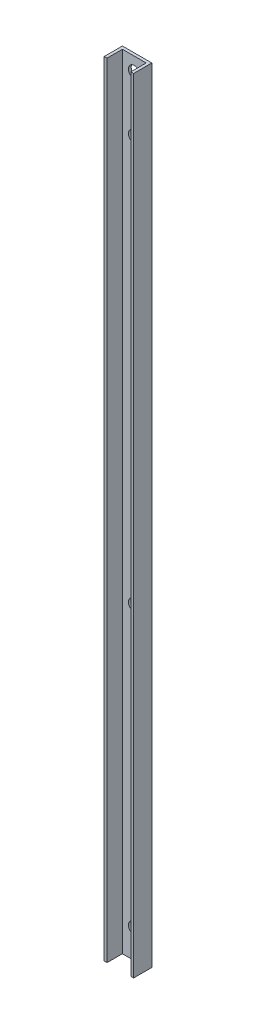
ISO-10303-21;
HEADER;
FILE_DESCRIPTION(('STEP AP214'),'2;1');
FILE_NAME('part.step','',(''),(''),'','','');
FILE_SCHEMA(('AUTOMOTIVE_DESIGN { 1 0 10303 214 1 1 1 1 }'));
ENDSEC;
DATA;
#1=APPLICATION_CONTEXT('core data for automotive mechanical design processes');
#2=APPLICATION_PROTOCOL_DEFINITION('international standard','automotive_design',2000,#1);
#3=PRODUCT_CONTEXT('',#1,'mechanical');
#4=PRODUCT('Part','Part','',(#3));
#5=PRODUCT_RELATED_PRODUCT_CATEGORY('part','',(#4));
#6=PRODUCT_DEFINITION_FORMATION('','',#4);
#7=PRODUCT_DEFINITION_CONTEXT('part definition',#1,'design');
#8=PRODUCT_DEFINITION('design','',#6,#7);
#9=PRODUCT_DEFINITION_SHAPE('','',#8);
#10=(LENGTH_UNIT() NAMED_UNIT(*) SI_UNIT(.MILLI.,.METRE.));
#11=(NAMED_UNIT(*) PLANE_ANGLE_UNIT() SI_UNIT($,.RADIAN.));
#12=(NAMED_UNIT(*) SI_UNIT($,.STERADIAN.) SOLID_ANGLE_UNIT());
#13=UNCERTAINTY_MEASURE_WITH_UNIT(LENGTH_MEASURE(1.E-05),#10,'distance_accuracy_value','');
#14=(GEOMETRIC_REPRESENTATION_CONTEXT(3) GLOBAL_UNCERTAINTY_ASSIGNED_CONTEXT((#13)) GLOBAL_UNIT_ASSIGNED_CONTEXT((#10,
#11,#12)) REPRESENTATION_CONTEXT('',''));
#15=CARTESIAN_POINT('',(0.,0.,0.));
#16=DIRECTION('',(0.,0.,1.));
#17=DIRECTION('',(1.,0.,0.));
#18=AXIS2_PLACEMENT_3D('',#15,#16,#17);
#19=CARTESIAN_POINT('',(6.03004291845494,280.,-4.68669527896996));
#20=DIRECTION('',(1.,0.,0.));
#21=DIRECTION('',(0.,0.,-1.));
#22=AXIS2_PLACEMENT_3D('',#19,#20,#21);
#23=PLANE('',#22);
#24=DIRECTION('',(0.,0.,1.));
#25=VECTOR('',#24,1.);
#26=CARTESIAN_POINT('',(6.03004291845494,0.,-4.68669527896996));
#27=LINE('',#26,#25);
#28=CARTESIAN_POINT('',(6.03004291845494,0.,-3.68669527896996));
#29=VERTEX_POINT('',#28);
#30=CARTESIAN_POINT('',(6.03004291845494,0.,1.81330472103004));
#31=VERTEX_POINT('',#30);
#32=EDGE_CURVE('E131',#29,#31,#27,.T.);
#33=ORIENTED_EDGE('',*,*,#32,.T.);
#34=DIRECTION('',(0.,-1.,0.));
#35=VECTOR('',#34,1.);
#36=CARTESIAN_POINT('',(6.03004291845494,280.,1.81330472103004));
#37=LINE('',#36,#35);
#38=CARTESIAN_POINT('',(6.03004291845494,280.,1.81330472103004));
#39=VERTEX_POINT('',#38);
#40=EDGE_CURVE('E11',#39,#31,#37,.T.);
#41=ORIENTED_EDGE('',*,*,#40,.F.);
#42=DIRECTION('',(0.,0.,1.));
#43=VECTOR('',#42,1.);
#44=CARTESIAN_POINT('',(6.03004291845494,280.,-4.68669527896996));
#45=LINE('',#44,#43);
#46=CARTESIAN_POINT('',(6.03004291845494,280.,-3.68669527896996));
#47=VERTEX_POINT('',#46);
#48=EDGE_CURVE('E89',#47,#39,#45,.T.);
#49=ORIENTED_EDGE('',*,*,#48,.F.);
#50=DIRECTION('',(0.,-1.,0.));
#51=VECTOR('',#50,1.);
#52=CARTESIAN_POINT('',(6.03004291845494,280.,-3.68669527896996));
#53=LINE('',#52,#51);
#54=EDGE_CURVE('E130',#47,#29,#53,.T.);
#55=ORIENTED_EDGE('',*,*,#54,.T.);
#56=EDGE_LOOP('',(#33,#41,#49,#55));
#57=FACE_BOUND('',#56,.T.);
#58=ADVANCED_FACE('F32',(#57),#23,.F.);
#59=CARTESIAN_POINT('',(7.03004291845494,280.,1.81330472103004));
#60=DIRECTION('',(0.,0.,1.));
#61=DIRECTION('',(1.,0.,0.));
#62=AXIS2_PLACEMENT_3D('',#59,#60,#61);
#63=PLANE('',#62);
#64=DIRECTION('',(-1.,0.,0.));
#65=VECTOR('',#64,1.);
#66=CARTESIAN_POINT('',(7.03004291845494,0.,1.81330472103004));
#67=LINE('',#66,#65);
#68=CARTESIAN_POINT('',(7.03004291845494,0.,1.81330472103004));
#69=VERTEX_POINT('',#68);
#70=EDGE_CURVE('E134',#69,#31,#67,.T.);
#71=ORIENTED_EDGE('',*,*,#70,.F.);
#72=DIRECTION('',(0.,-1.,0.));
#73=VECTOR('',#72,1.);
#74=CARTESIAN_POINT('',(7.03004291845494,280.,1.81330472103004));
#75=LINE('',#74,#73);
#76=CARTESIAN_POINT('',(7.03004291845494,280.,1.81330472103004));
#77=VERTEX_POINT('',#76);
#78=EDGE_CURVE('E41',#77,#69,#75,.T.);
#79=ORIENTED_EDGE('',*,*,#78,.F.);
#80=DIRECTION('',(-1.,0.,0.));
#81=VECTOR('',#80,1.);
#82=CARTESIAN_POINT('',(7.03004291845494,280.,1.81330472103004));
#83=LINE('',#82,#81);
#84=EDGE_CURVE('E182',#77,#39,#83,.T.);
#85=ORIENTED_EDGE('',*,*,#84,.T.);
#86=ORIENTED_EDGE('',*,*,#40,.T.);
#87=EDGE_LOOP('',(#71,#79,#85,#86));
#88=FACE_BOUND('',#87,.T.);
#89=ADVANCED_FACE('F213',(#88),#63,.T.);
#90=CARTESIAN_POINT('',(7.03004291845494,280.,-4.68669527896996));
#91=DIRECTION('',(1.,0.,0.));
#92=DIRECTION('',(0.,0.,-1.));
#93=AXIS2_PLACEMENT_3D('',#90,#91,#92);
#94=PLANE('',#93);
#95=DIRECTION('',(0.,0.,1.));
#96=VECTOR('',#95,1.);
#97=CARTESIAN_POINT('',(7.03004291845494,0.,-4.68669527896996));
#98=LINE('',#97,#96);
#99=CARTESIAN_POINT('',(7.03004291845494,0.,-4.68669527896996));
#100=VERTEX_POINT('',#99);
#101=EDGE_CURVE('E138',#100,#69,#98,.T.);
#102=ORIENTED_EDGE('',*,*,#101,.F.);
#103=DIRECTION('',(0.,-1.,0.));
#104=VECTOR('',#103,1.);
#105=CARTESIAN_POINT('',(7.03004291845494,280.,-4.68669527896996));
#106=LINE('',#105,#104);
#107=CARTESIAN_POINT('',(7.03004291845494,280.,-4.68669527896996));
#108=VERTEX_POINT('',#107);
#109=EDGE_CURVE('E155',#108,#100,#106,.T.);
#110=ORIENTED_EDGE('',*,*,#109,.F.);
#111=DIRECTION('',(0.,0.,1.));
#112=VECTOR('',#111,1.);
#113=CARTESIAN_POINT('',(7.03004291845494,280.,-4.68669527896996));
#114=LINE('',#113,#112);
#115=EDGE_CURVE('E185',#108,#77,#114,.T.);
#116=ORIENTED_EDGE('',*,*,#115,.T.);
#117=ORIENTED_EDGE('',*,*,#78,.T.);
#118=EDGE_LOOP('',(#102,#110,#116,#117));
#119=FACE_BOUND('',#118,.T.);
#120=ADVANCED_FACE('F217',(#119),#94,.T.);
#121=CARTESIAN_POINT('',(-3.46995708154506,280.,-4.68669527896996));
#122=DIRECTION('',(0.,0.,-1.));
#123=DIRECTION('',(-1.,0.,0.));
#124=AXIS2_PLACEMENT_3D('',#121,#122,#123);
#125=PLANE('',#124);
#126=CARTESIAN_POINT('',(1.78004291845504,9.99999999999993,-4.68669527896996));
#127=DIRECTION('',(0.,0.,-1.));
#128=DIRECTION('',(-1.,0.,0.));
#129=AXIS2_PLACEMENT_3D('',#126,#127,#128);
#130=CIRCLE('',#129,2.1);
#131=CARTESIAN_POINT('',(-0.319957081544957,9.99999999999993,-4.68669527896996));
#132=VERTEX_POINT('',#131);
#133=EDGE_CURVE('E176',#132,#132,#130,.T.);
#134=ORIENTED_EDGE('',*,*,#133,.F.);
#135=EDGE_LOOP('',(#134));
#136=FACE_BOUND('',#135,.T.);
#137=CARTESIAN_POINT('',(1.78004291845503,110.,-4.68669527896996));
#138=DIRECTION('',(0.,0.,-1.));
#139=DIRECTION('',(-1.,0.,0.));
#140=AXIS2_PLACEMENT_3D('',#137,#138,#139);
#141=CIRCLE('',#140,2.1);
#142=CARTESIAN_POINT('',(-0.319957081544972,110.,-4.68669527896996));
#143=VERTEX_POINT('',#142);
#144=EDGE_CURVE('E166',#143,#143,#141,.T.);
#145=ORIENTED_EDGE('',*,*,#144,.F.);
#146=EDGE_LOOP('',(#145));
#147=FACE_BOUND('',#146,.T.);
#148=CARTESIAN_POINT('',(1.780042918455,255.,-4.68669527896996));
#149=DIRECTION('',(0.,0.,-1.));
#150=DIRECTION('',(-1.,0.,0.));
#151=AXIS2_PLACEMENT_3D('',#148,#149,#150);
#152=CIRCLE('',#151,2.1);
#153=CARTESIAN_POINT('',(-0.319957081545003,255.,-4.68669527896996));
#154=VERTEX_POINT('',#153);
#155=EDGE_CURVE('E163',#154,#154,#152,.T.);
#156=ORIENTED_EDGE('',*,*,#155,.F.);
#157=EDGE_LOOP('',(#156));
#158=FACE_BOUND('',#157,.T.);
#159=CARTESIAN_POINT('',(1.780042918455,275.,-4.68669527896996));
#160=DIRECTION('',(0.,0.,-1.));
#161=DIRECTION('',(-1.,0.,0.));
#162=AXIS2_PLACEMENT_3D('',#159,#160,#161);
#163=CIRCLE('',#162,2.1);
#164=CARTESIAN_POINT('',(-0.319957081545003,275.,-4.68669527896996));
#165=VERTEX_POINT('',#164);
#166=EDGE_CURVE('E160',#165,#165,#163,.T.);
#167=ORIENTED_EDGE('',*,*,#166,.F.);
#168=EDGE_LOOP('',(#167));
#169=FACE_BOUND('',#168,.T.);
#170=DIRECTION('',(1.,0.,0.));
#171=VECTOR('',#170,1.);
#172=CARTESIAN_POINT('',(-3.46995708154506,0.,-4.68669527896996));
#173=LINE('',#172,#171);
#174=CARTESIAN_POINT('',(-3.46995708154506,0.,-4.68669527896996));
#175=VERTEX_POINT('',#174);
#176=EDGE_CURVE('E141',#175,#100,#173,.T.);
#177=ORIENTED_EDGE('',*,*,#176,.F.);
#178=DIRECTION('',(0.,-1.,0.));
#179=VECTOR('',#178,1.);
#180=CARTESIAN_POINT('',(-3.46995708154506,280.,-4.68669527896996));
#181=LINE('',#180,#179);
#182=CARTESIAN_POINT('',(-3.46995708154506,280.,-4.68669527896996));
#183=VERTEX_POINT('',#182);
#184=EDGE_CURVE('E153',#183,#175,#181,.T.);
#185=ORIENTED_EDGE('',*,*,#184,.F.);
#186=DIRECTION('',(1.,0.,0.));
#187=VECTOR('',#186,1.);
#188=CARTESIAN_POINT('',(-3.46995708154506,280.,-4.68669527896996));
#189=LINE('',#188,#187);
#190=EDGE_CURVE('E125',#183,#108,#189,.T.);
#191=ORIENTED_EDGE('',*,*,#190,.T.);
#192=ORIENTED_EDGE('',*,*,#109,.T.);
#193=EDGE_LOOP('',(#177,#185,#191,#192));
#194=FACE_BOUND('',#193,.T.);
#195=ADVANCED_FACE('F190',(#136,#147,#158,#169,#194),#125,.T.);
#196=CARTESIAN_POINT('',(-3.46995708154506,280.,1.81330472103004));
#197=DIRECTION('',(-1.,0.,0.));
#198=DIRECTION('',(0.,0.,1.));
#199=AXIS2_PLACEMENT_3D('',#196,#197,#198);
#200=PLANE('',#199);
#201=DIRECTION('',(0.,0.,-1.));
#202=VECTOR('',#201,1.);
#203=CARTESIAN_POINT('',(-3.46995708154506,0.,1.81330472103004));
#204=LINE('',#203,#202);
#205=CARTESIAN_POINT('',(-3.46995708154506,0.,1.81330472103004));
#206=VERTEX_POINT('',#205);
#207=EDGE_CURVE('E144',#206,#175,#204,.T.);
#208=ORIENTED_EDGE('',*,*,#207,.F.);
#209=DIRECTION('',(0.,-1.,0.));
#210=VECTOR('',#209,1.);
#211=CARTESIAN_POINT('',(-3.46995708154506,280.,1.81330472103004));
#212=LINE('',#211,#210);
#213=CARTESIAN_POINT('',(-3.46995708154506,280.,1.81330472103004));
#214=VERTEX_POINT('',#213);
#215=EDGE_CURVE('E113',#214,#206,#212,.T.);
#216=ORIENTED_EDGE('',*,*,#215,.F.);
#217=DIRECTION('',(0.,0.,-1.));
#218=VECTOR('',#217,1.);
#219=CARTESIAN_POINT('',(-3.46995708154506,280.,1.81330472103004));
#220=LINE('',#219,#218);
#221=EDGE_CURVE('E123',#214,#183,#220,.T.);
#222=ORIENTED_EDGE('',*,*,#221,.T.);
#223=ORIENTED_EDGE('',*,*,#184,.T.);
#224=EDGE_LOOP('',(#208,#216,#222,#223));
#225=FACE_BOUND('',#224,.T.);
#226=ADVANCED_FACE('F195',(#225),#200,.T.);
#227=CARTESIAN_POINT('',(-2.46995708154506,280.,1.81330472103004));
#228=DIRECTION('',(0.,0.,1.));
#229=DIRECTION('',(1.,0.,0.));
#230=AXIS2_PLACEMENT_3D('',#227,#228,#229);
#231=PLANE('',#230);
#232=DIRECTION('',(-1.,0.,0.));
#233=VECTOR('',#232,1.);
#234=CARTESIAN_POINT('',(-2.46995708154506,0.,1.81330472103004));
#235=LINE('',#234,#233);
#236=CARTESIAN_POINT('',(-2.46995708154506,0.,1.81330472103004));
#237=VERTEX_POINT('',#236);
#238=EDGE_CURVE('E112',#237,#206,#235,.T.);
#239=ORIENTED_EDGE('',*,*,#238,.F.);
#240=DIRECTION('',(0.,-1.,0.));
#241=VECTOR('',#240,1.);
#242=CARTESIAN_POINT('',(-2.46995708154506,280.,1.81330472103004));
#243=LINE('',#242,#241);
#244=CARTESIAN_POINT('',(-2.46995708154506,280.,1.81330472103004));
#245=VERTEX_POINT('',#244);
#246=EDGE_CURVE('E106',#245,#237,#243,.T.);
#247=ORIENTED_EDGE('',*,*,#246,.F.);
#248=DIRECTION('',(-1.,0.,0.));
#249=VECTOR('',#248,1.);
#250=CARTESIAN_POINT('',(-2.46995708154506,280.,1.81330472103004));
#251=LINE('',#250,#249);
#252=EDGE_CURVE('E110',#245,#214,#251,.T.);
#253=ORIENTED_EDGE('',*,*,#252,.T.);
#254=ORIENTED_EDGE('',*,*,#215,.T.);
#255=EDGE_LOOP('',(#239,#247,#253,#254));
#256=FACE_BOUND('',#255,.T.);
#257=ADVANCED_FACE('F108',(#256),#231,.T.);
#258=CARTESIAN_POINT('',(-2.46995708154506,280.,1.81330472103004));
#259=DIRECTION('',(-1.,0.,0.));
#260=DIRECTION('',(0.,0.,1.));
#261=AXIS2_PLACEMENT_3D('',#258,#259,#260);
#262=PLANE('',#261);
#263=DIRECTION('',(0.,0.,-1.));
#264=VECTOR('',#263,1.);
#265=CARTESIAN_POINT('',(-2.46995708154506,0.,1.81330472103004));
#266=LINE('',#265,#264);
#267=CARTESIAN_POINT('',(-2.46995708154506,0.,-3.68669527896996));
#268=VERTEX_POINT('',#267);
#269=EDGE_CURVE('E77',#237,#268,#266,.T.);
#270=ORIENTED_EDGE('',*,*,#269,.T.);
#271=DIRECTION('',(0.,-1.,0.));
#272=VECTOR('',#271,1.);
#273=CARTESIAN_POINT('',(-2.46995708154506,280.,-3.68669527896996));
#274=LINE('',#273,#272);
#275=CARTESIAN_POINT('',(-2.46995708154506,280.,-3.68669527896996));
#276=VERTEX_POINT('',#275);
#277=EDGE_CURVE('E114',#276,#268,#274,.T.);
#278=ORIENTED_EDGE('',*,*,#277,.F.);
#279=DIRECTION('',(0.,0.,-1.));
#280=VECTOR('',#279,1.);
#281=CARTESIAN_POINT('',(-2.46995708154506,280.,1.81330472103004));
#282=LINE('',#281,#280);
#283=EDGE_CURVE('E116',#245,#276,#282,.T.);
#284=ORIENTED_EDGE('',*,*,#283,.F.);
#285=ORIENTED_EDGE('',*,*,#246,.T.);
#286=EDGE_LOOP('',(#270,#278,#284,#285));
#287=FACE_BOUND('',#286,.T.);
#288=ADVANCED_FACE('F117',(#287),#262,.F.);
#289=CARTESIAN_POINT('',(-3.46995708154506,280.,-3.68669527896996));
#290=DIRECTION('',(0.,0.,-1.));
#291=DIRECTION('',(-1.,0.,0.));
#292=AXIS2_PLACEMENT_3D('',#289,#290,#291);
#293=PLANE('',#292);
#294=CARTESIAN_POINT('',(1.78004291845504,9.99999999999993,-3.68669527896996));
#295=DIRECTION('',(0.,0.,-1.));
#296=DIRECTION('',(-1.,0.,0.));
#297=AXIS2_PLACEMENT_3D('',#294,#295,#296);
#298=CIRCLE('',#297,2.1);
#299=CARTESIAN_POINT('',(-0.319957081544957,9.99999999999993,-3.68669527896996));
#300=VERTEX_POINT('',#299);
#301=EDGE_CURVE('E35',#300,#300,#298,.T.);
#302=ORIENTED_EDGE('',*,*,#301,.T.);
#303=EDGE_LOOP('',(#302));
#304=FACE_BOUND('',#303,.T.);
#305=CARTESIAN_POINT('',(1.78004291845503,110.,-3.68669527896996));
#306=DIRECTION('',(0.,0.,-1.));
#307=DIRECTION('',(-1.,0.,0.));
#308=AXIS2_PLACEMENT_3D('',#305,#306,#307);
#309=CIRCLE('',#308,2.1);
#310=CARTESIAN_POINT('',(-0.319957081544972,110.,-3.68669527896996));
#311=VERTEX_POINT('',#310);
#312=EDGE_CURVE('E164',#311,#311,#309,.T.);
#313=ORIENTED_EDGE('',*,*,#312,.T.);
#314=EDGE_LOOP('',(#313));
#315=FACE_BOUND('',#314,.T.);
#316=CARTESIAN_POINT('',(1.780042918455,255.,-3.68669527896996));
#317=DIRECTION('',(0.,0.,-1.));
#318=DIRECTION('',(-1.,0.,0.));
#319=AXIS2_PLACEMENT_3D('',#316,#317,#318);
#320=CIRCLE('',#319,2.1);
#321=CARTESIAN_POINT('',(-0.319957081545003,255.,-3.68669527896996));
#322=VERTEX_POINT('',#321);
#323=EDGE_CURVE('E161',#322,#322,#320,.T.);
#324=ORIENTED_EDGE('',*,*,#323,.T.);
#325=EDGE_LOOP('',(#324));
#326=FACE_BOUND('',#325,.T.);
#327=CARTESIAN_POINT('',(1.780042918455,275.,-3.68669527896996));
#328=DIRECTION('',(0.,0.,-1.));
#329=DIRECTION('',(-1.,0.,0.));
#330=AXIS2_PLACEMENT_3D('',#327,#328,#329);
#331=CIRCLE('',#330,2.1);
#332=CARTESIAN_POINT('',(-0.319957081545003,275.,-3.68669527896996));
#333=VERTEX_POINT('',#332);
#334=EDGE_CURVE('E135',#333,#333,#331,.T.);
#335=ORIENTED_EDGE('',*,*,#334,.T.);
#336=EDGE_LOOP('',(#335));
#337=FACE_BOUND('',#336,.T.);
#338=DIRECTION('',(1.,0.,0.));
#339=VECTOR('',#338,1.);
#340=CARTESIAN_POINT('',(-3.46995708154506,0.,-3.68669527896996));
#341=LINE('',#340,#339);
#342=EDGE_CURVE('E83',#268,#29,#341,.T.);
#343=ORIENTED_EDGE('',*,*,#342,.T.);
#344=ORIENTED_EDGE('',*,*,#54,.F.);
#345=DIRECTION('',(1.,0.,0.));
#346=VECTOR('',#345,1.);
#347=CARTESIAN_POINT('',(-3.46995708154506,280.,-3.68669527896996));
#348=LINE('',#347,#346);
#349=EDGE_CURVE('E50',#276,#47,#348,.T.);
#350=ORIENTED_EDGE('',*,*,#349,.F.);
#351=ORIENTED_EDGE('',*,*,#277,.T.);
#352=EDGE_LOOP('',(#343,#344,#350,#351));
#353=FACE_BOUND('',#352,.T.);
#354=ADVANCED_FACE('F201',(#304,#315,#326,#337,#353),#293,.F.);
#355=CARTESIAN_POINT('',(0.,280.,0.));
#356=DIRECTION('',(0.,-1.,0.));
#357=DIRECTION('',(-1.,0.,0.));
#358=AXIS2_PLACEMENT_3D('',#355,#356,#357);
#359=PLANE('',#358);
#360=ORIENTED_EDGE('',*,*,#48,.T.);
#361=ORIENTED_EDGE('',*,*,#84,.F.);
#362=ORIENTED_EDGE('',*,*,#115,.F.);
#363=ORIENTED_EDGE('',*,*,#190,.F.);
#364=ORIENTED_EDGE('',*,*,#221,.F.);
#365=ORIENTED_EDGE('',*,*,#252,.F.);
#366=ORIENTED_EDGE('',*,*,#283,.T.);
#367=ORIENTED_EDGE('',*,*,#349,.T.);
#368=EDGE_LOOP('',(#360,#361,#362,#363,#364,#365,#366,#367));
#369=FACE_BOUND('',#368,.T.);
#370=ADVANCED_FACE('F120',(#369),#359,.F.);
#371=CARTESIAN_POINT('',(0.,0.,0.));
#372=DIRECTION('',(0.,-1.,0.));
#373=DIRECTION('',(-1.,0.,0.));
#374=AXIS2_PLACEMENT_3D('',#371,#372,#373);
#375=PLANE('',#374);
#376=ORIENTED_EDGE('',*,*,#32,.F.);
#377=ORIENTED_EDGE('',*,*,#342,.F.);
#378=ORIENTED_EDGE('',*,*,#269,.F.);
#379=ORIENTED_EDGE('',*,*,#238,.T.);
#380=ORIENTED_EDGE('',*,*,#207,.T.);
#381=ORIENTED_EDGE('',*,*,#176,.T.);
#382=ORIENTED_EDGE('',*,*,#101,.T.);
#383=ORIENTED_EDGE('',*,*,#70,.T.);
#384=EDGE_LOOP('',(#376,#377,#378,#379,#380,#381,#382,#383));
#385=FACE_BOUND('',#384,.T.);
#386=ADVANCED_FACE('F198',(#385),#375,.T.);
#387=CARTESIAN_POINT('',(1.780042918455,275.,5.31330472103004));
#388=DIRECTION('',(0.,0.,-1.));
#389=DIRECTION('',(-1.,0.,0.));
#390=AXIS2_PLACEMENT_3D('',#387,#388,#389);
#391=CYLINDRICAL_SURFACE('',#390,2.1);
#392=ORIENTED_EDGE('',*,*,#166,.T.);
#393=EDGE_LOOP('',(#392));
#394=FACE_BOUND('',#393,.T.);
#395=ORIENTED_EDGE('',*,*,#334,.F.);
#396=EDGE_LOOP('',(#395));
#397=FACE_BOUND('',#396,.T.);
#398=ADVANCED_FACE('F255',(#394,#397),#391,.F.);
#399=CARTESIAN_POINT('',(1.780042918455,255.,5.31330472103004));
#400=DIRECTION('',(0.,0.,-1.));
#401=DIRECTION('',(-1.,0.,0.));
#402=AXIS2_PLACEMENT_3D('',#399,#400,#401);
#403=CYLINDRICAL_SURFACE('',#402,2.1);
#404=ORIENTED_EDGE('',*,*,#155,.T.);
#405=EDGE_LOOP('',(#404));
#406=FACE_BOUND('',#405,.T.);
#407=ORIENTED_EDGE('',*,*,#323,.F.);
#408=EDGE_LOOP('',(#407));
#409=FACE_BOUND('',#408,.T.);
#410=ADVANCED_FACE('F274',(#406,#409),#403,.F.);
#411=CARTESIAN_POINT('',(1.78004291845503,110.,5.31330472103004));
#412=DIRECTION('',(0.,0.,-1.));
#413=DIRECTION('',(-1.,0.,0.));
#414=AXIS2_PLACEMENT_3D('',#411,#412,#413);
#415=CYLINDRICAL_SURFACE('',#414,2.1);
#416=ORIENTED_EDGE('',*,*,#144,.T.);
#417=EDGE_LOOP('',(#416));
#418=FACE_BOUND('',#417,.T.);
#419=ORIENTED_EDGE('',*,*,#312,.F.);
#420=EDGE_LOOP('',(#419));
#421=FACE_BOUND('',#420,.T.);
#422=ADVANCED_FACE('F284',(#418,#421),#415,.F.);
#423=CARTESIAN_POINT('',(1.78004291845504,9.99999999999993,5.31330472103004));
#424=DIRECTION('',(0.,0.,-1.));
#425=DIRECTION('',(-1.,0.,0.));
#426=AXIS2_PLACEMENT_3D('',#423,#424,#425);
#427=CYLINDRICAL_SURFACE('',#426,2.1);
#428=ORIENTED_EDGE('',*,*,#133,.T.);
#429=EDGE_LOOP('',(#428));
#430=FACE_BOUND('',#429,.T.);
#431=ORIENTED_EDGE('',*,*,#301,.F.);
#432=EDGE_LOOP('',(#431));
#433=FACE_BOUND('',#432,.T.);
#434=ADVANCED_FACE('F294',(#430,#433),#427,.F.);
#435=CLOSED_SHELL('',(#58,#89,#120,#195,#226,#257,#288,#354,#370,#386,#398,#410,#422,#434));
#436=MANIFOLD_SOLID_BREP('B2',#435);
#437=ADVANCED_BREP_SHAPE_REPRESENTATION('',(#18,#436),#14);
#438=SHAPE_DEFINITION_REPRESENTATION(#9,#437);
ENDSEC;
END-ISO-10303-21;
